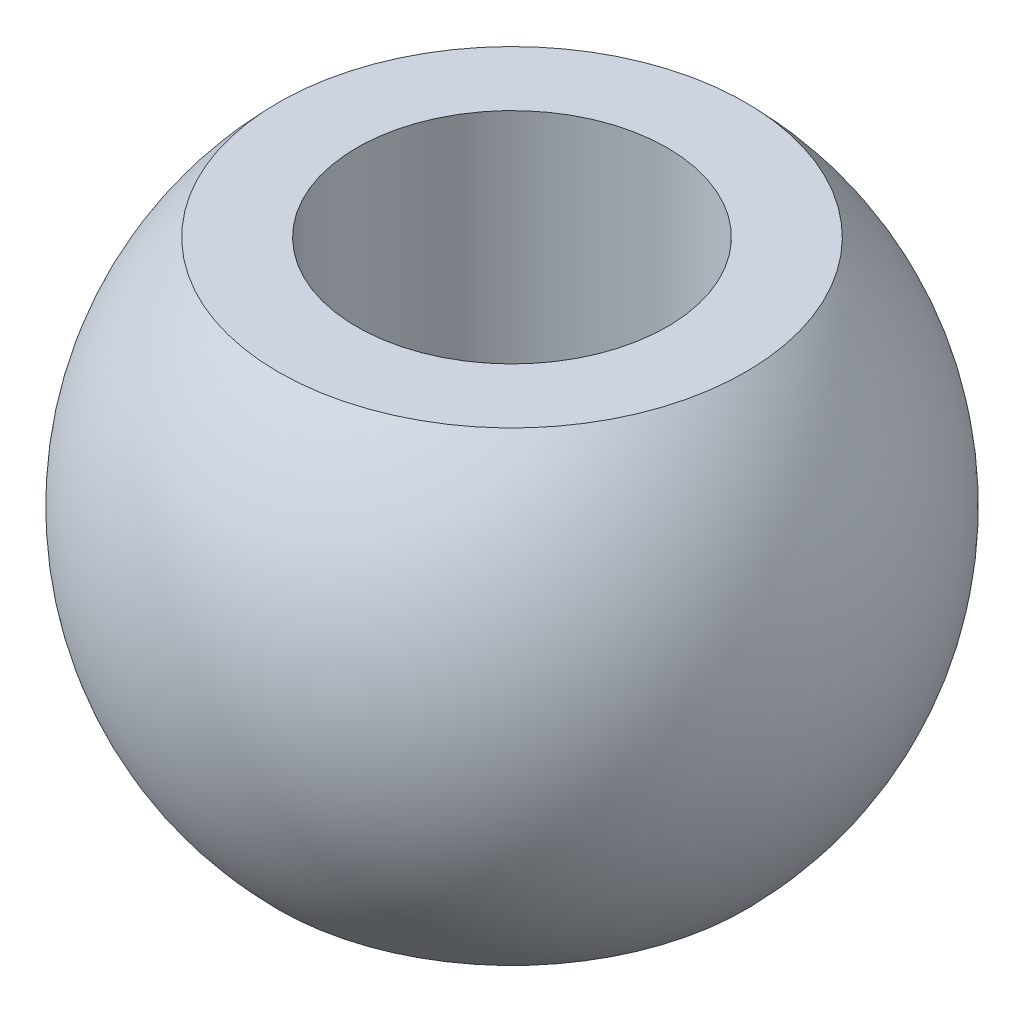
ISO-10303-21;
HEADER;
FILE_DESCRIPTION(('STEP AP214'),'2;1');
FILE_NAME('part.step','',(''),(''),'','','');
FILE_SCHEMA(('AUTOMOTIVE_DESIGN { 1 0 10303 214 1 1 1 1 }'));
ENDSEC;
DATA;
#1=APPLICATION_CONTEXT('core data for automotive mechanical design processes');
#2=APPLICATION_PROTOCOL_DEFINITION('international standard','automotive_design',2000,#1);
#3=PRODUCT_CONTEXT('',#1,'mechanical');
#4=PRODUCT('Part','Part','',(#3));
#5=PRODUCT_RELATED_PRODUCT_CATEGORY('part','',(#4));
#6=PRODUCT_DEFINITION_FORMATION('','',#4);
#7=PRODUCT_DEFINITION_CONTEXT('part definition',#1,'design');
#8=PRODUCT_DEFINITION('design','',#6,#7);
#9=PRODUCT_DEFINITION_SHAPE('','',#8);
#10=(LENGTH_UNIT() NAMED_UNIT(*) SI_UNIT(.MILLI.,.METRE.));
#11=(NAMED_UNIT(*) PLANE_ANGLE_UNIT() SI_UNIT($,.RADIAN.));
#12=(NAMED_UNIT(*) SI_UNIT($,.STERADIAN.) SOLID_ANGLE_UNIT());
#13=UNCERTAINTY_MEASURE_WITH_UNIT(LENGTH_MEASURE(1.E-05),#10,'distance_accuracy_value','');
#14=(GEOMETRIC_REPRESENTATION_CONTEXT(3) GLOBAL_UNCERTAINTY_ASSIGNED_CONTEXT((#13)) GLOBAL_UNIT_ASSIGNED_CONTEXT((#10,
#11,#12)) REPRESENTATION_CONTEXT('',''));
#15=CARTESIAN_POINT('',(0.,0.,0.));
#16=DIRECTION('',(0.,0.,1.));
#17=DIRECTION('',(1.,0.,0.));
#18=AXIS2_PLACEMENT_3D('',#15,#16,#17);
#19=CARTESIAN_POINT('',(0.,0.,0.));
#20=DIRECTION('',(0.,-1.,0.));
#21=DIRECTION('',(0.,0.,-1.));
#22=AXIS2_PLACEMENT_3D('',#19,#20,#21);
#23=CYLINDRICAL_SURFACE('',#22,4.);
#24=CARTESIAN_POINT('',(0.,6.,0.));
#25=DIRECTION('',(0.,-1.,0.));
#26=DIRECTION('',(0.,0.,-1.));
#27=AXIS2_PLACEMENT_3D('',#24,#25,#26);
#28=CIRCLE('',#27,4.);
#29=CARTESIAN_POINT('',(0.,6.,-4.));
#30=VERTEX_POINT('',#29);
#31=EDGE_CURVE('E26',#30,#30,#28,.T.);
#32=ORIENTED_EDGE('',*,*,#31,.F.);
#33=EDGE_LOOP('',(#32));
#34=FACE_BOUND('',#33,.T.);
#35=CARTESIAN_POINT('',(0.,-6.,0.));
#36=DIRECTION('',(0.,-1.,0.));
#37=DIRECTION('',(0.,0.,-1.));
#38=AXIS2_PLACEMENT_3D('',#35,#36,#37);
#39=CIRCLE('',#38,4.);
#40=CARTESIAN_POINT('',(0.,-6.,-4.));
#41=VERTEX_POINT('',#40);
#42=EDGE_CURVE('E17',#41,#41,#39,.F.);
#43=ORIENTED_EDGE('',*,*,#42,.F.);
#44=EDGE_LOOP('',(#43));
#45=FACE_BOUND('',#44,.T.);
#46=ADVANCED_FACE('F14',(#34,#45),#23,.F.);
#47=CARTESIAN_POINT('',(0.,-6.,0.));
#48=DIRECTION('',(0.,-1.,0.));
#49=DIRECTION('',(0.,0.,-1.));
#50=AXIS2_PLACEMENT_3D('',#47,#48,#49);
#51=PLANE('',#50);
#52=ORIENTED_EDGE('',*,*,#42,.T.);
#53=EDGE_LOOP('',(#52));
#54=FACE_BOUND('',#53,.T.);
#55=CARTESIAN_POINT('',(0.,-6.,0.));
#56=DIRECTION('',(0.,1.,0.));
#57=DIRECTION('',(0.,0.,1.));
#58=AXIS2_PLACEMENT_3D('',#55,#56,#57);
#59=CIRCLE('',#58,6.02079728939615);
#60=CARTESIAN_POINT('',(0.,-6.,6.02079728939615));
#61=VERTEX_POINT('',#60);
#62=EDGE_CURVE('E21',#61,#61,#59,.T.);
#63=ORIENTED_EDGE('',*,*,#62,.F.);
#64=EDGE_LOOP('',(#63));
#65=FACE_BOUND('',#64,.T.);
#66=ADVANCED_FACE('F36',(#54,#65),#51,.T.);
#67=CARTESIAN_POINT('',(0.,6.,0.));
#68=DIRECTION('',(0.,1.,0.));
#69=DIRECTION('',(0.,0.,1.));
#70=AXIS2_PLACEMENT_3D('',#67,#68,#69);
#71=PLANE('',#70);
#72=ORIENTED_EDGE('',*,*,#31,.T.);
#73=EDGE_LOOP('',(#72));
#74=FACE_BOUND('',#73,.T.);
#75=CARTESIAN_POINT('',(0.,6.,0.));
#76=DIRECTION('',(0.,1.,0.));
#77=DIRECTION('',(0.,0.,1.));
#78=AXIS2_PLACEMENT_3D('',#75,#76,#77);
#79=CIRCLE('',#78,6.02079728939615);
#80=CARTESIAN_POINT('',(0.,6.,6.02079728939615));
#81=VERTEX_POINT('',#80);
#82=EDGE_CURVE('E9',#81,#81,#79,.F.);
#83=ORIENTED_EDGE('',*,*,#82,.F.);
#84=EDGE_LOOP('',(#83));
#85=FACE_BOUND('',#84,.T.);
#86=ADVANCED_FACE('F45',(#74,#85),#71,.T.);
#87=CARTESIAN_POINT('',(0.,0.,0.));
#88=DIRECTION('',(0.,1.,0.));
#89=DIRECTION('',(-1.,0.,0.));
#90=AXIS2_PLACEMENT_3D('',#87,#88,#89);
#91=SPHERICAL_SURFACE('',#90,8.5);
#92=ORIENTED_EDGE('',*,*,#62,.T.);
#93=EDGE_LOOP('',(#92));
#94=FACE_BOUND('',#93,.T.);
#95=ORIENTED_EDGE('',*,*,#82,.T.);
#96=EDGE_LOOP('',(#95));
#97=FACE_BOUND('',#96,.T.);
#98=ADVANCED_FACE('F46',(#94,#97),#91,.T.);
#99=CLOSED_SHELL('',(#46,#66,#86,#98));
#100=MANIFOLD_SOLID_BREP('B1',#99);
#101=ADVANCED_BREP_SHAPE_REPRESENTATION('',(#18,#100),#14);
#102=SHAPE_DEFINITION_REPRESENTATION(#9,#101);
ENDSEC;
END-ISO-10303-21;
